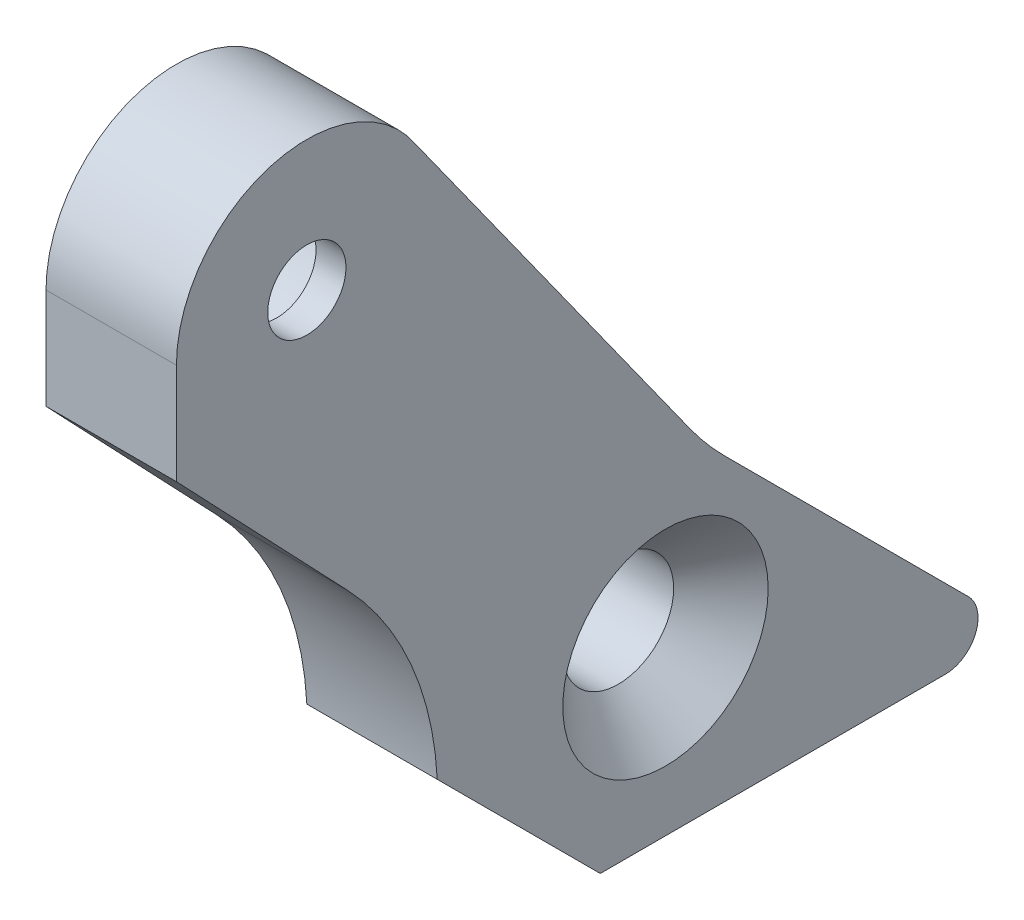
ISO-10303-21;
HEADER;
FILE_DESCRIPTION(('STEP AP214'),'2;1');
FILE_NAME('part.step','',(''),(''),'','','');
FILE_SCHEMA(('AUTOMOTIVE_DESIGN { 1 0 10303 214 1 1 1 1 }'));
ENDSEC;
DATA;
#1=APPLICATION_CONTEXT('core data for automotive mechanical design processes');
#2=APPLICATION_PROTOCOL_DEFINITION('international standard','automotive_design',2000,#1);
#3=PRODUCT_CONTEXT('',#1,'mechanical');
#4=PRODUCT('Part','Part','',(#3));
#5=PRODUCT_RELATED_PRODUCT_CATEGORY('part','',(#4));
#6=PRODUCT_DEFINITION_FORMATION('','',#4);
#7=PRODUCT_DEFINITION_CONTEXT('part definition',#1,'design');
#8=PRODUCT_DEFINITION('design','',#6,#7);
#9=PRODUCT_DEFINITION_SHAPE('','',#8);
#10=(LENGTH_UNIT() NAMED_UNIT(*) SI_UNIT(.MILLI.,.METRE.));
#11=(NAMED_UNIT(*) PLANE_ANGLE_UNIT() SI_UNIT($,.RADIAN.));
#12=(NAMED_UNIT(*) SI_UNIT($,.STERADIAN.) SOLID_ANGLE_UNIT());
#13=UNCERTAINTY_MEASURE_WITH_UNIT(LENGTH_MEASURE(1.E-05),#10,'distance_accuracy_value','');
#14=(GEOMETRIC_REPRESENTATION_CONTEXT(3) GLOBAL_UNCERTAINTY_ASSIGNED_CONTEXT((#13)) GLOBAL_UNIT_ASSIGNED_CONTEXT((#10,
#11,#12)) REPRESENTATION_CONTEXT('',''));
#15=CARTESIAN_POINT('',(0.,0.,0.));
#16=DIRECTION('',(0.,0.,1.));
#17=DIRECTION('',(1.,0.,0.));
#18=AXIS2_PLACEMENT_3D('',#15,#16,#17);
#19=CARTESIAN_POINT('',(4.,0.,0.));
#20=DIRECTION('',(0.,0.689683794027428,-0.724110671276106));
#21=DIRECTION('',(0.,0.724110671276106,0.689683794027428));
#22=AXIS2_PLACEMENT_3D('',#19,#20,#21);
#23=PLANE('',#22);
#24=DIRECTION('',(0.,-0.724110671276106,-0.689683794027428));
#25=VECTOR('',#24,1.);
#26=CARTESIAN_POINT('',(0.,0.,0.));
#27=LINE('',#26,#25);
#28=CARTESIAN_POINT('',(0.,0.,0.));
#29=VERTEX_POINT('',#28);
#30=CARTESIAN_POINT('',(0.,-5.51611161748978,-5.25385543887186));
#31=VERTEX_POINT('',#30);
#32=EDGE_CURVE('E205',#29,#31,#27,.T.);
#33=ORIENTED_EDGE('',*,*,#32,.T.);
#34=DIRECTION('',(1.,0.,0.));
#35=VECTOR('',#34,1.);
#36=CARTESIAN_POINT('',(4.,-5.51611161748978,-5.25385543887187));
#37=LINE('',#36,#35);
#38=CARTESIAN_POINT('',(4.,-5.51611161748978,-5.25385543887186));
#39=VERTEX_POINT('',#38);
#40=EDGE_CURVE('E137',#31,#39,#37,.T.);
#41=ORIENTED_EDGE('',*,*,#40,.T.);
#42=DIRECTION('',(0.,-0.724110671276106,-0.689683794027428));
#43=VECTOR('',#42,1.);
#44=CARTESIAN_POINT('',(4.,0.,0.));
#45=LINE('',#44,#43);
#46=CARTESIAN_POINT('',(4.,0.,0.));
#47=VERTEX_POINT('',#46);
#48=EDGE_CURVE('E120',#47,#39,#45,.T.);
#49=ORIENTED_EDGE('',*,*,#48,.F.);
#50=DIRECTION('',(-1.,0.,0.));
#51=VECTOR('',#50,1.);
#52=CARTESIAN_POINT('',(4.,0.,0.));
#53=LINE('',#52,#51);
#54=EDGE_CURVE('E186',#47,#29,#53,.T.);
#55=ORIENTED_EDGE('',*,*,#54,.T.);
#56=EDGE_LOOP('',(#33,#41,#49,#55));
#57=FACE_BOUND('',#56,.T.);
#58=ADVANCED_FACE('F37',(#57),#23,.F.);
#59=CARTESIAN_POINT('',(4.,-11.9081605006336,-8.));
#60=DIRECTION('',(0.,0.707106781186548,-0.707106781186547));
#61=DIRECTION('',(0.,0.707106781186547,0.707106781186548));
#62=AXIS2_PLACEMENT_3D('',#59,#60,#61);
#63=PLANE('',#62);
#64=DIRECTION('',(0.,-0.707106781186547,-0.707106781186548));
#65=VECTOR('',#64,1.);
#66=CARTESIAN_POINT('',(0.,-11.9081605006336,-8.));
#67=LINE('',#66,#65);
#68=CARTESIAN_POINT('',(0.,-11.9081605006336,-8.));
#69=VERTEX_POINT('',#68);
#70=CARTESIAN_POINT('',(0.,-16.9081605006336,-13.));
#71=VERTEX_POINT('',#70);
#72=EDGE_CURVE('E179',#69,#71,#67,.T.);
#73=ORIENTED_EDGE('',*,*,#72,.T.);
#74=DIRECTION('',(-1.,0.,0.));
#75=VECTOR('',#74,1.);
#76=CARTESIAN_POINT('',(4.,-16.9081605006336,-13.));
#77=LINE('',#76,#75);
#78=CARTESIAN_POINT('',(4.,-16.9081605006336,-13.));
#79=VERTEX_POINT('',#78);
#80=EDGE_CURVE('E133',#79,#71,#77,.T.);
#81=ORIENTED_EDGE('',*,*,#80,.F.);
#82=DIRECTION('',(0.,-0.707106781186547,-0.707106781186548));
#83=VECTOR('',#82,1.);
#84=CARTESIAN_POINT('',(4.,-11.9081605006336,-8.));
#85=LINE('',#84,#83);
#86=CARTESIAN_POINT('',(4.,-11.9081605006336,-8.));
#87=VERTEX_POINT('',#86);
#88=EDGE_CURVE('E117',#87,#79,#85,.T.);
#89=ORIENTED_EDGE('',*,*,#88,.F.);
#90=DIRECTION('',(-1.,0.,0.));
#91=VECTOR('',#90,1.);
#92=CARTESIAN_POINT('',(4.,-11.9081605006336,-8.));
#93=LINE('',#92,#91);
#94=EDGE_CURVE('E130',#87,#69,#93,.T.);
#95=ORIENTED_EDGE('',*,*,#94,.T.);
#96=EDGE_LOOP('',(#73,#81,#89,#95));
#97=FACE_BOUND('',#96,.T.);
#98=ADVANCED_FACE('F129',(#97),#63,.F.);
#99=CARTESIAN_POINT('',(4.,-16.9081605006336,-13.));
#100=DIRECTION('',(0.,1.,0.));
#101=DIRECTION('',(0.,0.,1.));
#102=AXIS2_PLACEMENT_3D('',#99,#100,#101);
#103=PLANE('',#102);
#104=DIRECTION('',(0.,0.,-1.));
#105=VECTOR('',#104,1.);
#106=CARTESIAN_POINT('',(0.,-16.9081605006336,-13.));
#107=LINE('',#106,#105);
#108=CARTESIAN_POINT('',(0.,-16.9081605006336,-23.5857864376269));
#109=VERTEX_POINT('',#108);
#110=EDGE_CURVE('E175',#71,#109,#107,.T.);
#111=ORIENTED_EDGE('',*,*,#110,.T.);
#112=DIRECTION('',(-1.,0.,0.));
#113=VECTOR('',#112,1.);
#114=CARTESIAN_POINT('',(4.,-16.9081605006336,-23.5857864376269));
#115=LINE('',#114,#113);
#116=CARTESIAN_POINT('',(4.,-16.9081605006336,-23.5857864376269));
#117=VERTEX_POINT('',#116);
#118=EDGE_CURVE('E45',#109,#117,#115,.F.);
#119=ORIENTED_EDGE('',*,*,#118,.T.);
#120=DIRECTION('',(0.,0.,-1.));
#121=VECTOR('',#120,1.);
#122=CARTESIAN_POINT('',(4.,-16.9081605006336,-13.));
#123=LINE('',#122,#121);
#124=EDGE_CURVE('E134',#79,#117,#123,.T.);
#125=ORIENTED_EDGE('',*,*,#124,.F.);
#126=ORIENTED_EDGE('',*,*,#80,.T.);
#127=EDGE_LOOP('',(#111,#119,#125,#126));
#128=FACE_BOUND('',#127,.T.);
#129=ADVANCED_FACE('F222',(#128),#103,.F.);
#130=CARTESIAN_POINT('',(4.,-16.9081605006336,-26.));
#131=DIRECTION('',(0.,-0.707106781186544,0.707106781186551));
#132=DIRECTION('',(0.,-0.707106781186551,-0.707106781186544));
#133=AXIS2_PLACEMENT_3D('',#130,#131,#132);
#134=PLANE('',#133);
#135=DIRECTION('',(0.,0.707106781186551,0.707106781186544));
#136=VECTOR('',#135,1.);
#137=CARTESIAN_POINT('',(4.,-16.9081605006336,-26.));
#138=LINE('',#137,#136);
#139=CARTESIAN_POINT('',(4.,-15.2010537194471,-24.2928932188135));
#140=VERTEX_POINT('',#139);
#141=CARTESIAN_POINT('',(4.,-7.71714531588667,-16.8089848152531));
#142=VERTEX_POINT('',#141);
#143=EDGE_CURVE('E168',#140,#142,#138,.T.);
#144=ORIENTED_EDGE('',*,*,#143,.F.);
#145=DIRECTION('',(-1.,0.,0.));
#146=VECTOR('',#145,1.);
#147=CARTESIAN_POINT('',(4.,-15.2010537194471,-24.2928932188135));
#148=LINE('',#147,#146);
#149=CARTESIAN_POINT('',(0.,-15.2010537194471,-24.2928932188135));
#150=VERTEX_POINT('',#149);
#151=EDGE_CURVE('E160',#140,#150,#148,.T.);
#152=ORIENTED_EDGE('',*,*,#151,.T.);
#153=DIRECTION('',(0.,0.707106781186551,0.707106781186544));
#154=VECTOR('',#153,1.);
#155=CARTESIAN_POINT('',(0.,-16.9081605006336,-26.));
#156=LINE('',#155,#154);
#157=CARTESIAN_POINT('',(0.,-7.71714531588667,-16.8089848152531));
#158=VERTEX_POINT('',#157);
#159=EDGE_CURVE('E167',#150,#158,#156,.T.);
#160=ORIENTED_EDGE('',*,*,#159,.T.);
#161=DIRECTION('',(-1.,0.,0.));
#162=VECTOR('',#161,1.);
#163=CARTESIAN_POINT('',(4.,-7.71714531588667,-16.8089848152531));
#164=LINE('',#163,#162);
#165=EDGE_CURVE('E152',#158,#142,#164,.F.);
#166=ORIENTED_EDGE('',*,*,#165,.T.);
#167=EDGE_LOOP('',(#144,#152,#160,#166));
#168=FACE_BOUND('',#167,.T.);
#169=ADVANCED_FACE('F166',(#168),#134,.F.);
#170=CARTESIAN_POINT('',(4.,5.25913739827213,-7.36196665917416));
#171=DIRECTION('',(0.,-0.581745374112938,0.81337096069272));
#172=DIRECTION('',(0.,-0.81337096069272,-0.581745374112938));
#173=AXIS2_PLACEMENT_3D('',#170,#171,#172);
#174=PLANE('',#173);
#175=DIRECTION('',(0.,0.81337096069272,0.581745374112938));
#176=VECTOR('',#175,1.);
#177=CARTESIAN_POINT('',(4.,5.25913739827213,-7.36196665917416));
#178=LINE('',#177,#176);
#179=CARTESIAN_POINT('',(4.,-6.46353124515061,-15.7463430201915));
#180=VERTEX_POINT('',#179);
#181=CARTESIAN_POINT('',(4.,5.25913739827213,-7.36196665917416));
#182=VERTEX_POINT('',#181);
#183=EDGE_CURVE('E218',#180,#182,#178,.T.);
#184=ORIENTED_EDGE('',*,*,#183,.F.);
#185=DIRECTION('',(-1.,0.,0.));
#186=VECTOR('',#185,1.);
#187=CARTESIAN_POINT('',(0.,-6.46353124515061,-15.7463430201914));
#188=LINE('',#187,#186);
#189=CARTESIAN_POINT('',(0.,-6.46353124515061,-15.7463430201915));
#190=VERTEX_POINT('',#189);
#191=EDGE_CURVE('E139',#180,#190,#188,.T.);
#192=ORIENTED_EDGE('',*,*,#191,.T.);
#193=DIRECTION('',(0.,0.81337096069272,0.581745374112938));
#194=VECTOR('',#193,1.);
#195=CARTESIAN_POINT('',(0.,5.25913739827213,-7.36196665917416));
#196=LINE('',#195,#194);
#197=CARTESIAN_POINT('',(0.,5.25913739827213,-7.36196665917416));
#198=VERTEX_POINT('',#197);
#199=EDGE_CURVE('E174',#190,#198,#196,.T.);
#200=ORIENTED_EDGE('',*,*,#199,.T.);
#201=DIRECTION('',(-1.,0.,0.));
#202=VECTOR('',#201,1.);
#203=CARTESIAN_POINT('',(4.,5.25913739827213,-7.36196665917416));
#204=LINE('',#203,#202);
#205=EDGE_CURVE('E141',#182,#198,#204,.T.);
#206=ORIENTED_EDGE('',*,*,#205,.F.);
#207=EDGE_LOOP('',(#184,#192,#200,#206));
#208=FACE_BOUND('',#207,.T.);
#209=ADVANCED_FACE('F275',(#208),#174,.F.);
#210=CARTESIAN_POINT('',(4.,3.09183949936636,-4.));
#211=DIRECTION('',(-1.,0.,0.));
#212=DIRECTION('',(0.,0.,1.));
#213=AXIS2_PLACEMENT_3D('',#210,#211,#212);
#214=CYLINDRICAL_SURFACE('',#213,4.);
#215=CARTESIAN_POINT('',(0.,3.09183949936636,-4.));
#216=DIRECTION('',(1.,0.,0.));
#217=DIRECTION('',(0.,0.,1.));
#218=AXIS2_PLACEMENT_3D('',#215,#216,#217);
#219=CIRCLE('',#218,4.);
#220=CARTESIAN_POINT('',(0.,3.09183949936636,0.));
#221=VERTEX_POINT('',#220);
#222=EDGE_CURVE('E177',#198,#221,#219,.T.);
#223=ORIENTED_EDGE('',*,*,#222,.T.);
#224=DIRECTION('',(-1.,0.,0.));
#225=VECTOR('',#224,1.);
#226=CARTESIAN_POINT('',(4.,3.09183949936636,0.));
#227=LINE('',#226,#225);
#228=CARTESIAN_POINT('',(4.,3.09183949936636,0.));
#229=VERTEX_POINT('',#228);
#230=EDGE_CURVE('E189',#229,#221,#227,.T.);
#231=ORIENTED_EDGE('',*,*,#230,.F.);
#232=CARTESIAN_POINT('',(4.,3.09183949936636,-4.));
#233=DIRECTION('',(1.,0.,0.));
#234=DIRECTION('',(0.,0.,1.));
#235=AXIS2_PLACEMENT_3D('',#232,#233,#234);
#236=CIRCLE('',#235,4.);
#237=EDGE_CURVE('E199',#182,#229,#236,.T.);
#238=ORIENTED_EDGE('',*,*,#237,.F.);
#239=ORIENTED_EDGE('',*,*,#205,.T.);
#240=EDGE_LOOP('',(#223,#231,#238,#239));
#241=FACE_BOUND('',#240,.T.);
#242=ADVANCED_FACE('F197',(#241),#214,.T.);
#243=CARTESIAN_POINT('',(4.,0.,0.));
#244=DIRECTION('',(0.,0.,-1.));
#245=DIRECTION('',(-1.,0.,0.));
#246=AXIS2_PLACEMENT_3D('',#243,#244,#245);
#247=PLANE('',#246);
#248=DIRECTION('',(0.,-1.,0.));
#249=VECTOR('',#248,1.);
#250=CARTESIAN_POINT('',(0.,0.,0.));
#251=LINE('',#250,#249);
#252=EDGE_CURVE('E184',#221,#29,#251,.T.);
#253=ORIENTED_EDGE('',*,*,#252,.T.);
#254=ORIENTED_EDGE('',*,*,#54,.F.);
#255=DIRECTION('',(0.,-1.,0.));
#256=VECTOR('',#255,1.);
#257=CARTESIAN_POINT('',(4.,0.,0.));
#258=LINE('',#257,#256);
#259=EDGE_CURVE('E190',#229,#47,#258,.T.);
#260=ORIENTED_EDGE('',*,*,#259,.F.);
#261=ORIENTED_EDGE('',*,*,#230,.T.);
#262=EDGE_LOOP('',(#253,#254,#260,#261));
#263=FACE_BOUND('',#262,.T.);
#264=ADVANCED_FACE('F208',(#263),#247,.F.);
#265=CARTESIAN_POINT('',(4.,3.09183949936636,-4.));
#266=DIRECTION('',(-1.,0.,0.));
#267=DIRECTION('',(0.,0.,1.));
#268=AXIS2_PLACEMENT_3D('',#265,#266,#267);
#269=PLANE('',#268);
#270=CARTESIAN_POINT('',(4.,-11.9081605006336,-15.));
#271=DIRECTION('',(1.,0.,0.));
#272=DIRECTION('',(0.,0.,-1.));
#273=AXIS2_PLACEMENT_3D('',#270,#271,#272);
#274=CIRCLE('',#273,3.15);
#275=CARTESIAN_POINT('',(4.,-11.9081605006336,-18.15));
#276=VERTEX_POINT('',#275);
#277=EDGE_CURVE('E425',#276,#276,#274,.T.);
#278=ORIENTED_EDGE('',*,*,#277,.F.);
#279=EDGE_LOOP('',(#278));
#280=FACE_BOUND('',#279,.T.);
#281=CARTESIAN_POINT('',(4.,3.09183949936636,-4.));
#282=DIRECTION('',(1.,0.,0.));
#283=DIRECTION('',(0.,0.,-1.));
#284=AXIS2_PLACEMENT_3D('',#281,#282,#283);
#285=CIRCLE('',#284,1.2);
#286=CARTESIAN_POINT('',(4.,3.09183949936636,-5.2));
#287=VERTEX_POINT('',#286);
#288=EDGE_CURVE('E148',#287,#287,#285,.T.);
#289=ORIENTED_EDGE('',*,*,#288,.F.);
#290=EDGE_LOOP('',(#289));
#291=FACE_BOUND('',#290,.T.);
#292=ORIENTED_EDGE('',*,*,#124,.T.);
#293=CARTESIAN_POINT('',(4.,-15.9081605006336,-23.5857864376269));
#294=DIRECTION('',(-1.,0.,0.));
#295=DIRECTION('',(0.,0.,1.));
#296=AXIS2_PLACEMENT_3D('',#293,#294,#295);
#297=CIRCLE('',#296,1.);
#298=EDGE_CURVE('E11',#117,#140,#297,.F.);
#299=ORIENTED_EDGE('',*,*,#298,.T.);
#300=ORIENTED_EDGE('',*,*,#143,.T.);
#301=CARTESIAN_POINT('',(4.,-0.646077504021231,-23.8800526271187));
#302=DIRECTION('',(-1.,0.,0.));
#303=DIRECTION('',(0.,0.,1.));
#304=AXIS2_PLACEMENT_3D('',#301,#302,#303);
#305=CIRCLE('',#304,10.);
#306=EDGE_CURVE('E158',#142,#180,#305,.T.);
#307=ORIENTED_EDGE('',*,*,#306,.T.);
#308=ORIENTED_EDGE('',*,*,#183,.T.);
#309=ORIENTED_EDGE('',*,*,#237,.T.);
#310=ORIENTED_EDGE('',*,*,#259,.T.);
#311=ORIENTED_EDGE('',*,*,#48,.T.);
#312=CARTESIAN_POINT('',(4.,-12.4129495577641,1.9872512738892));
#313=DIRECTION('',(-1.,0.,0.));
#314=DIRECTION('',(0.,0.,1.));
#315=AXIS2_PLACEMENT_3D('',#312,#313,#314);
#316=CIRCLE('',#315,10.);
#317=EDGE_CURVE('E114',#39,#87,#316,.T.);
#318=ORIENTED_EDGE('',*,*,#317,.T.);
#319=ORIENTED_EDGE('',*,*,#88,.T.);
#320=EDGE_LOOP('',(#292,#299,#300,#307,#308,#309,#310,#311,#318,#319));
#321=FACE_BOUND('',#320,.T.);
#322=ADVANCED_FACE('F116',(#280,#291,#321),#269,.F.);
#323=CARTESIAN_POINT('',(0.,3.09183949936636,-4.));
#324=DIRECTION('',(-1.,0.,0.));
#325=DIRECTION('',(0.,0.,1.));
#326=AXIS2_PLACEMENT_3D('',#323,#324,#325);
#327=PLANE('',#326);
#328=CARTESIAN_POINT('',(0.,-11.9081605006336,-15.));
#329=DIRECTION('',(1.,0.,0.));
#330=DIRECTION('',(0.,0.,-1.));
#331=AXIS2_PLACEMENT_3D('',#328,#329,#330);
#332=CIRCLE('',#331,1.7);
#333=CARTESIAN_POINT('',(0.,-11.9081605006336,-16.7));
#334=VERTEX_POINT('',#333);
#335=EDGE_CURVE('E413',#334,#334,#332,.T.);
#336=ORIENTED_EDGE('',*,*,#335,.T.);
#337=EDGE_LOOP('',(#336));
#338=FACE_BOUND('',#337,.T.);
#339=CARTESIAN_POINT('',(0.,3.09183949936636,-4.));
#340=DIRECTION('',(-1.,0.,0.));
#341=DIRECTION('',(0.,0.,1.));
#342=AXIS2_PLACEMENT_3D('',#339,#340,#341);
#343=CIRCLE('',#342,2.99999999999999);
#344=CARTESIAN_POINT('',(0.,3.09183949936636,-1.00000000000001));
#345=VERTEX_POINT('',#344);
#346=EDGE_CURVE('E147',#345,#345,#343,.T.);
#347=ORIENTED_EDGE('',*,*,#346,.F.);
#348=EDGE_LOOP('',(#347));
#349=FACE_BOUND('',#348,.T.);
#350=ORIENTED_EDGE('',*,*,#159,.F.);
#351=CARTESIAN_POINT('',(0.,-15.9081605006336,-23.5857864376269));
#352=DIRECTION('',(-1.,0.,0.));
#353=DIRECTION('',(0.,0.,1.));
#354=AXIS2_PLACEMENT_3D('',#351,#352,#353);
#355=CIRCLE('',#354,1.);
#356=EDGE_CURVE('E59',#150,#109,#355,.T.);
#357=ORIENTED_EDGE('',*,*,#356,.T.);
#358=ORIENTED_EDGE('',*,*,#110,.F.);
#359=ORIENTED_EDGE('',*,*,#72,.F.);
#360=CARTESIAN_POINT('',(0.,-12.4129495577641,1.9872512738892));
#361=DIRECTION('',(-1.,0.,0.));
#362=DIRECTION('',(0.,0.,1.));
#363=AXIS2_PLACEMENT_3D('',#360,#361,#362);
#364=CIRCLE('',#363,10.);
#365=EDGE_CURVE('E125',#69,#31,#364,.F.);
#366=ORIENTED_EDGE('',*,*,#365,.T.);
#367=ORIENTED_EDGE('',*,*,#32,.F.);
#368=ORIENTED_EDGE('',*,*,#252,.F.);
#369=ORIENTED_EDGE('',*,*,#222,.F.);
#370=ORIENTED_EDGE('',*,*,#199,.F.);
#371=CARTESIAN_POINT('',(0.,-0.646077504021231,-23.8800526271187));
#372=DIRECTION('',(-1.,0.,0.));
#373=DIRECTION('',(0.,0.,1.));
#374=AXIS2_PLACEMENT_3D('',#371,#372,#373);
#375=CIRCLE('',#374,10.);
#376=EDGE_CURVE('E124',#190,#158,#375,.F.);
#377=ORIENTED_EDGE('',*,*,#376,.T.);
#378=EDGE_LOOP('',(#350,#357,#358,#359,#366,#367,#368,#369,#370,#377));
#379=FACE_BOUND('',#378,.T.);
#380=ADVANCED_FACE('F171',(#338,#349,#379),#327,.T.);
#381=CARTESIAN_POINT('',(2.,3.09183949936636,-4.));
#382=DIRECTION('',(-1.,0.,0.));
#383=DIRECTION('',(0.,0.,1.));
#384=AXIS2_PLACEMENT_3D('',#381,#382,#383);
#385=CONICAL_SURFACE('',#384,2.99999999999999,1.02974425867665);
#386=CARTESIAN_POINT('',(3.08154911424961,3.09183949936636,-4.));
#387=DIRECTION('',(-1.,0.,0.));
#388=DIRECTION('',(0.,0.,1.));
#389=AXIS2_PLACEMENT_3D('',#386,#387,#388);
#390=CIRCLE('',#389,1.2);
#391=CARTESIAN_POINT('',(3.08154911424961,3.09183949936636,-2.8));
#392=VERTEX_POINT('',#391);
#393=EDGE_CURVE('E145',#392,#392,#390,.F.);
#394=ORIENTED_EDGE('',*,*,#393,.T.);
#395=EDGE_LOOP('',(#394));
#396=FACE_BOUND('',#395,.T.);
#397=CARTESIAN_POINT('',(2.,3.09183949936636,-4.));
#398=DIRECTION('',(-1.,0.,0.));
#399=DIRECTION('',(0.,0.,1.));
#400=AXIS2_PLACEMENT_3D('',#397,#398,#399);
#401=CIRCLE('',#400,2.99999999999999);
#402=CARTESIAN_POINT('',(2.,3.09183949936636,-1.00000000000001));
#403=VERTEX_POINT('',#402);
#404=EDGE_CURVE('E213',#403,#403,#401,.T.);
#405=ORIENTED_EDGE('',*,*,#404,.T.);
#406=EDGE_LOOP('',(#405));
#407=FACE_BOUND('',#406,.T.);
#408=ADVANCED_FACE('F260',(#396,#407),#385,.F.);
#409=CARTESIAN_POINT('',(0.,3.09183949936636,-4.));
#410=DIRECTION('',(-1.,0.,0.));
#411=DIRECTION('',(0.,0.,1.));
#412=AXIS2_PLACEMENT_3D('',#409,#410,#411);
#413=CYLINDRICAL_SURFACE('',#412,2.99999999999999);
#414=ORIENTED_EDGE('',*,*,#404,.F.);
#415=EDGE_LOOP('',(#414));
#416=FACE_BOUND('',#415,.T.);
#417=ORIENTED_EDGE('',*,*,#346,.T.);
#418=EDGE_LOOP('',(#417));
#419=FACE_BOUND('',#418,.T.);
#420=ADVANCED_FACE('F256',(#416,#419),#413,.F.);
#421=CARTESIAN_POINT('',(0.,3.09183949936636,-4.));
#422=DIRECTION('',(1.,0.,0.));
#423=DIRECTION('',(0.,0.,-1.));
#424=AXIS2_PLACEMENT_3D('',#421,#422,#423);
#425=CYLINDRICAL_SURFACE('',#424,1.2);
#426=ORIENTED_EDGE('',*,*,#288,.T.);
#427=EDGE_LOOP('',(#426));
#428=FACE_BOUND('',#427,.T.);
#429=ORIENTED_EDGE('',*,*,#393,.F.);
#430=EDGE_LOOP('',(#429));
#431=FACE_BOUND('',#430,.T.);
#432=ADVANCED_FACE('F248',(#428,#431),#425,.F.);
#433=CARTESIAN_POINT('',(4.,-11.9081605006336,-15.));
#434=DIRECTION('',(1.,0.,0.));
#435=DIRECTION('',(0.,0.,-1.));
#436=AXIS2_PLACEMENT_3D('',#433,#434,#435);
#437=CYLINDRICAL_SURFACE('',#436,1.7);
#438=ORIENTED_EDGE('',*,*,#335,.F.);
#439=EDGE_LOOP('',(#438));
#440=FACE_BOUND('',#439,.T.);
#441=CARTESIAN_POINT('',(2.55,-11.9081605006336,-15.));
#442=DIRECTION('',(1.,0.,0.));
#443=DIRECTION('',(0.,0.,-1.));
#444=AXIS2_PLACEMENT_3D('',#441,#442,#443);
#445=CIRCLE('',#444,1.7);
#446=CARTESIAN_POINT('',(2.55,-11.9081605006336,-16.7));
#447=VERTEX_POINT('',#446);
#448=EDGE_CURVE('E422',#447,#447,#445,.T.);
#449=ORIENTED_EDGE('',*,*,#448,.T.);
#450=EDGE_LOOP('',(#449));
#451=FACE_BOUND('',#450,.T.);
#452=ADVANCED_FACE('F242',(#440,#451),#437,.F.);
#453=CARTESIAN_POINT('',(4.,-11.9081605006336,-15.));
#454=DIRECTION('',(1.,0.,0.));
#455=DIRECTION('',(0.,0.,-1.));
#456=AXIS2_PLACEMENT_3D('',#453,#454,#455);
#457=CONICAL_SURFACE('',#456,3.15,0.785398163397449);
#458=ORIENTED_EDGE('',*,*,#448,.F.);
#459=EDGE_LOOP('',(#458));
#460=FACE_BOUND('',#459,.T.);
#461=ORIENTED_EDGE('',*,*,#277,.T.);
#462=EDGE_LOOP('',(#461));
#463=FACE_BOUND('',#462,.T.);
#464=ADVANCED_FACE('F238',(#460,#463),#457,.F.);
#465=CARTESIAN_POINT('',(4.,-12.4129495577641,1.9872512738892));
#466=DIRECTION('',(1.,0.,0.));
#467=DIRECTION('',(0.,0.,-1.));
#468=AXIS2_PLACEMENT_3D('',#465,#466,#467);
#469=CYLINDRICAL_SURFACE('',#468,10.);
#470=ORIENTED_EDGE('',*,*,#317,.F.);
#471=ORIENTED_EDGE('',*,*,#40,.F.);
#472=ORIENTED_EDGE('',*,*,#365,.F.);
#473=ORIENTED_EDGE('',*,*,#94,.F.);
#474=EDGE_LOOP('',(#470,#471,#472,#473));
#475=FACE_BOUND('',#474,.T.);
#476=ADVANCED_FACE('F136',(#475),#469,.F.);
#477=CARTESIAN_POINT('',(4.,-0.646077504021231,-23.8800526271187));
#478=DIRECTION('',(1.,0.,0.));
#479=DIRECTION('',(0.,0.,-1.));
#480=AXIS2_PLACEMENT_3D('',#477,#478,#479);
#481=CYLINDRICAL_SURFACE('',#480,10.);
#482=ORIENTED_EDGE('',*,*,#306,.F.);
#483=ORIENTED_EDGE('',*,*,#165,.F.);
#484=ORIENTED_EDGE('',*,*,#376,.F.);
#485=ORIENTED_EDGE('',*,*,#191,.F.);
#486=EDGE_LOOP('',(#482,#483,#484,#485));
#487=FACE_BOUND('',#486,.T.);
#488=ADVANCED_FACE('F224',(#487),#481,.F.);
#489=CARTESIAN_POINT('',(4.,-15.9081605006336,-23.5857864376269));
#490=DIRECTION('',(-1.,0.,0.));
#491=DIRECTION('',(0.,0.,1.));
#492=AXIS2_PLACEMENT_3D('',#489,#490,#491);
#493=CYLINDRICAL_SURFACE('',#492,1.);
#494=ORIENTED_EDGE('',*,*,#298,.F.);
#495=ORIENTED_EDGE('',*,*,#118,.F.);
#496=ORIENTED_EDGE('',*,*,#356,.F.);
#497=ORIENTED_EDGE('',*,*,#151,.F.);
#498=EDGE_LOOP('',(#494,#495,#496,#497));
#499=FACE_BOUND('',#498,.T.);
#500=ADVANCED_FACE('F39',(#499),#493,.T.);
#501=CLOSED_SHELL('',(#58,#98,#129,#169,#209,#242,#264,#322,#380,#408,#420,#432,#452,#464,#476,
#488,#500));
#502=MANIFOLD_SOLID_BREP('B2',#501);
#503=ADVANCED_BREP_SHAPE_REPRESENTATION('',(#18,#502),#14);
#504=SHAPE_DEFINITION_REPRESENTATION(#9,#503);
ENDSEC;
END-ISO-10303-21;
